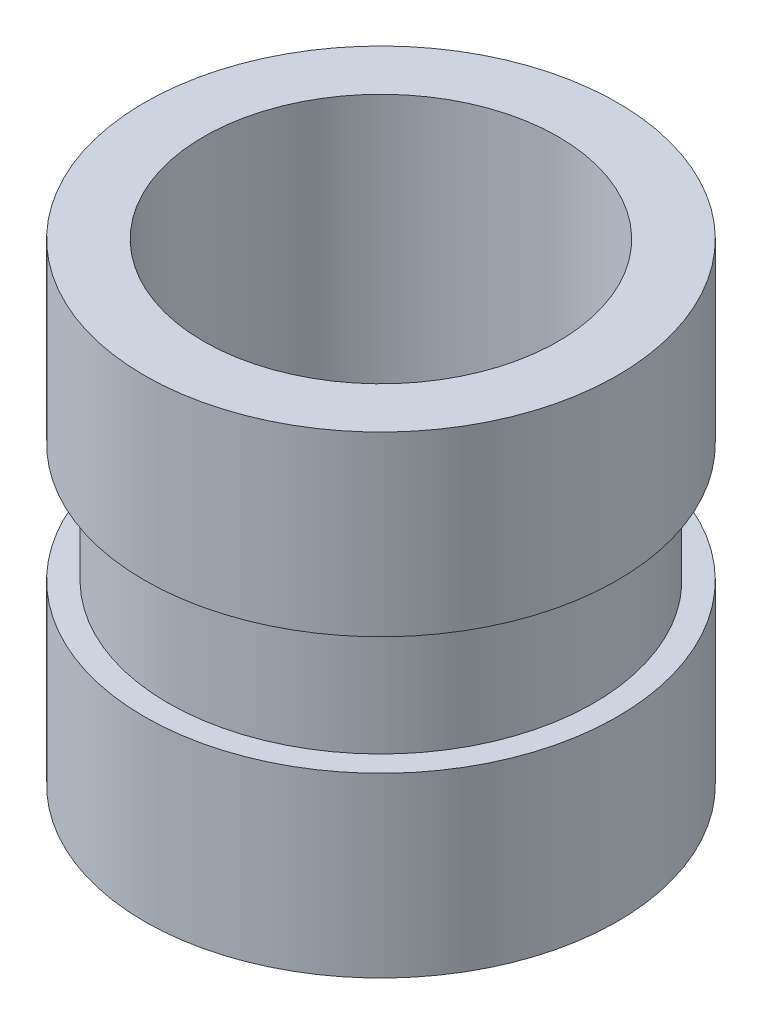
ISO-10303-21;
HEADER;
FILE_DESCRIPTION(('STEP AP214'),'2;1');
FILE_NAME('part.step','',(''),(''),'','','');
FILE_SCHEMA(('AUTOMOTIVE_DESIGN { 1 0 10303 214 1 1 1 1 }'));
ENDSEC;
DATA;
#1=APPLICATION_CONTEXT('core data for automotive mechanical design processes');
#2=APPLICATION_PROTOCOL_DEFINITION('international standard','automotive_design',2000,#1);
#3=PRODUCT_CONTEXT('',#1,'mechanical');
#4=PRODUCT('Part','Part','',(#3));
#5=PRODUCT_RELATED_PRODUCT_CATEGORY('part','',(#4));
#6=PRODUCT_DEFINITION_FORMATION('','',#4);
#7=PRODUCT_DEFINITION_CONTEXT('part definition',#1,'design');
#8=PRODUCT_DEFINITION('design','',#6,#7);
#9=PRODUCT_DEFINITION_SHAPE('','',#8);
#10=(LENGTH_UNIT() NAMED_UNIT(*) SI_UNIT(.MILLI.,.METRE.));
#11=(NAMED_UNIT(*) PLANE_ANGLE_UNIT() SI_UNIT($,.RADIAN.));
#12=(NAMED_UNIT(*) SI_UNIT($,.STERADIAN.) SOLID_ANGLE_UNIT());
#13=UNCERTAINTY_MEASURE_WITH_UNIT(LENGTH_MEASURE(1.E-05),#10,'distance_accuracy_value','');
#14=(GEOMETRIC_REPRESENTATION_CONTEXT(3) GLOBAL_UNCERTAINTY_ASSIGNED_CONTEXT((#13)) GLOBAL_UNIT_ASSIGNED_CONTEXT((#10,
#11,#12)) REPRESENTATION_CONTEXT('',''));
#15=CARTESIAN_POINT('',(0.,0.,0.));
#16=DIRECTION('',(0.,0.,1.));
#17=DIRECTION('',(1.,0.,0.));
#18=AXIS2_PLACEMENT_3D('',#15,#16,#17);
#19=CARTESIAN_POINT('',(0.,4.902028775,0.));
#20=DIRECTION('',(0.,1.,0.));
#21=DIRECTION('',(0.,0.,1.));
#22=AXIS2_PLACEMENT_3D('',#19,#20,#21);
#23=CYLINDRICAL_SURFACE('',#22,1.5);
#24=CARTESIAN_POINT('',(0.,0.,0.));
#25=DIRECTION('',(0.,1.,0.));
#26=DIRECTION('',(0.,0.,1.));
#27=AXIS2_PLACEMENT_3D('',#24,#25,#26);
#28=CIRCLE('',#27,1.5);
#29=CARTESIAN_POINT('',(0.,0.,1.5));
#30=VERTEX_POINT('',#29);
#31=EDGE_CURVE('E10',#30,#30,#28,.T.);
#32=ORIENTED_EDGE('',*,*,#31,.F.);
#33=EDGE_LOOP('',(#32));
#34=FACE_BOUND('',#33,.T.);
#35=CARTESIAN_POINT('',(0.,4.,0.));
#36=DIRECTION('',(0.,1.,0.));
#37=DIRECTION('',(0.,0.,1.));
#38=AXIS2_PLACEMENT_3D('',#35,#36,#37);
#39=CIRCLE('',#38,1.5);
#40=CARTESIAN_POINT('',(0.,4.,1.5));
#41=VERTEX_POINT('',#40);
#42=EDGE_CURVE('E58',#41,#41,#39,.T.);
#43=ORIENTED_EDGE('',*,*,#42,.T.);
#44=EDGE_LOOP('',(#43));
#45=FACE_BOUND('',#44,.T.);
#46=ADVANCED_FACE('F30',(#34,#45),#23,.F.);
#47=CARTESIAN_POINT('',(1.5,0.,0.));
#48=DIRECTION('',(0.,1.,0.));
#49=DIRECTION('',(0.,0.,1.));
#50=AXIS2_PLACEMENT_3D('',#47,#48,#49);
#51=PLANE('',#50);
#52=CARTESIAN_POINT('',(0.,0.,0.));
#53=DIRECTION('',(0.,1.,0.));
#54=DIRECTION('',(0.,0.,1.));
#55=AXIS2_PLACEMENT_3D('',#52,#53,#54);
#56=CIRCLE('',#55,2.);
#57=CARTESIAN_POINT('',(0.,0.,2.));
#58=VERTEX_POINT('',#57);
#59=EDGE_CURVE('E36',#58,#58,#56,.T.);
#60=ORIENTED_EDGE('',*,*,#59,.F.);
#61=EDGE_LOOP('',(#60));
#62=FACE_BOUND('',#61,.T.);
#63=ORIENTED_EDGE('',*,*,#31,.T.);
#64=EDGE_LOOP('',(#63));
#65=FACE_BOUND('',#64,.T.);
#66=ADVANCED_FACE('F95',(#62,#65),#51,.F.);
#67=CARTESIAN_POINT('',(0.,4.902028775,0.));
#68=DIRECTION('',(0.,1.,0.));
#69=DIRECTION('',(0.,0.,1.));
#70=AXIS2_PLACEMENT_3D('',#67,#68,#69);
#71=CYLINDRICAL_SURFACE('',#70,2.);
#72=CARTESIAN_POINT('',(0.,1.5,0.));
#73=DIRECTION('',(0.,1.,0.));
#74=DIRECTION('',(0.,0.,1.));
#75=AXIS2_PLACEMENT_3D('',#72,#73,#74);
#76=CIRCLE('',#75,2.);
#77=CARTESIAN_POINT('',(0.,1.5,2.));
#78=VERTEX_POINT('',#77);
#79=EDGE_CURVE('E40',#78,#78,#76,.T.);
#80=ORIENTED_EDGE('',*,*,#79,.F.);
#81=EDGE_LOOP('',(#80));
#82=FACE_BOUND('',#81,.T.);
#83=ORIENTED_EDGE('',*,*,#59,.T.);
#84=EDGE_LOOP('',(#83));
#85=FACE_BOUND('',#84,.T.);
#86=ADVANCED_FACE('F90',(#82,#85),#71,.T.);
#87=CARTESIAN_POINT('',(2.,1.5,0.));
#88=DIRECTION('',(0.,-1.,0.));
#89=DIRECTION('',(0.,0.,-1.));
#90=AXIS2_PLACEMENT_3D('',#87,#88,#89);
#91=PLANE('',#90);
#92=CARTESIAN_POINT('',(0.,1.5,0.));
#93=DIRECTION('',(0.,1.,0.));
#94=DIRECTION('',(0.,0.,1.));
#95=AXIS2_PLACEMENT_3D('',#92,#93,#94);
#96=CIRCLE('',#95,1.8);
#97=CARTESIAN_POINT('',(0.,1.5,1.8));
#98=VERTEX_POINT('',#97);
#99=EDGE_CURVE('E44',#98,#98,#96,.T.);
#100=ORIENTED_EDGE('',*,*,#99,.F.);
#101=EDGE_LOOP('',(#100));
#102=FACE_BOUND('',#101,.T.);
#103=ORIENTED_EDGE('',*,*,#79,.T.);
#104=EDGE_LOOP('',(#103));
#105=FACE_BOUND('',#104,.T.);
#106=ADVANCED_FACE('F84',(#102,#105),#91,.F.);
#107=CARTESIAN_POINT('',(0.,4.902028775,0.));
#108=DIRECTION('',(0.,1.,0.));
#109=DIRECTION('',(0.,0.,1.));
#110=AXIS2_PLACEMENT_3D('',#107,#108,#109);
#111=CYLINDRICAL_SURFACE('',#110,1.8);
#112=CARTESIAN_POINT('',(0.,2.5,0.));
#113=DIRECTION('',(0.,1.,0.));
#114=DIRECTION('',(0.,0.,1.));
#115=AXIS2_PLACEMENT_3D('',#112,#113,#114);
#116=CIRCLE('',#115,1.8);
#117=CARTESIAN_POINT('',(0.,2.5,1.8));
#118=VERTEX_POINT('',#117);
#119=EDGE_CURVE('E49',#118,#118,#116,.T.);
#120=ORIENTED_EDGE('',*,*,#119,.F.);
#121=EDGE_LOOP('',(#120));
#122=FACE_BOUND('',#121,.T.);
#123=ORIENTED_EDGE('',*,*,#99,.T.);
#124=EDGE_LOOP('',(#123));
#125=FACE_BOUND('',#124,.T.);
#126=ADVANCED_FACE('F78',(#122,#125),#111,.T.);
#127=CARTESIAN_POINT('',(1.8,2.5,0.));
#128=DIRECTION('',(0.,1.,0.));
#129=DIRECTION('',(0.,0.,1.));
#130=AXIS2_PLACEMENT_3D('',#127,#128,#129);
#131=PLANE('',#130);
#132=CARTESIAN_POINT('',(0.,2.5,0.));
#133=DIRECTION('',(0.,1.,0.));
#134=DIRECTION('',(0.,0.,1.));
#135=AXIS2_PLACEMENT_3D('',#132,#133,#134);
#136=CIRCLE('',#135,2.);
#137=CARTESIAN_POINT('',(0.,2.5,2.));
#138=VERTEX_POINT('',#137);
#139=EDGE_CURVE('E52',#138,#138,#136,.T.);
#140=ORIENTED_EDGE('',*,*,#139,.F.);
#141=EDGE_LOOP('',(#140));
#142=FACE_BOUND('',#141,.T.);
#143=ORIENTED_EDGE('',*,*,#119,.T.);
#144=EDGE_LOOP('',(#143));
#145=FACE_BOUND('',#144,.T.);
#146=ADVANCED_FACE('F72',(#142,#145),#131,.F.);
#147=CARTESIAN_POINT('',(0.,4.902028775,0.));
#148=DIRECTION('',(0.,1.,0.));
#149=DIRECTION('',(0.,0.,1.));
#150=AXIS2_PLACEMENT_3D('',#147,#148,#149);
#151=CYLINDRICAL_SURFACE('',#150,2.);
#152=CARTESIAN_POINT('',(0.,4.,0.));
#153=DIRECTION('',(0.,1.,0.));
#154=DIRECTION('',(0.,0.,1.));
#155=AXIS2_PLACEMENT_3D('',#152,#153,#154);
#156=CIRCLE('',#155,2.);
#157=CARTESIAN_POINT('',(0.,4.,2.));
#158=VERTEX_POINT('',#157);
#159=EDGE_CURVE('E55',#158,#158,#156,.T.);
#160=ORIENTED_EDGE('',*,*,#159,.F.);
#161=EDGE_LOOP('',(#160));
#162=FACE_BOUND('',#161,.T.);
#163=ORIENTED_EDGE('',*,*,#139,.T.);
#164=EDGE_LOOP('',(#163));
#165=FACE_BOUND('',#164,.T.);
#166=ADVANCED_FACE('F66',(#162,#165),#151,.T.);
#167=CARTESIAN_POINT('',(2.,4.,0.));
#168=DIRECTION('',(0.,-1.,0.));
#169=DIRECTION('',(0.,0.,-1.));
#170=AXIS2_PLACEMENT_3D('',#167,#168,#169);
#171=PLANE('',#170);
#172=ORIENTED_EDGE('',*,*,#42,.F.);
#173=EDGE_LOOP('',(#172));
#174=FACE_BOUND('',#173,.T.);
#175=ORIENTED_EDGE('',*,*,#159,.T.);
#176=EDGE_LOOP('',(#175));
#177=FACE_BOUND('',#176,.T.);
#178=ADVANCED_FACE('F63',(#174,#177),#171,.F.);
#179=CLOSED_SHELL('',(#46,#66,#86,#106,#126,#146,#166,#178));
#180=MANIFOLD_SOLID_BREP('B2',#179);
#181=ADVANCED_BREP_SHAPE_REPRESENTATION('',(#18,#180),#14);
#182=SHAPE_DEFINITION_REPRESENTATION(#9,#181);
ENDSEC;
END-ISO-10303-21;
